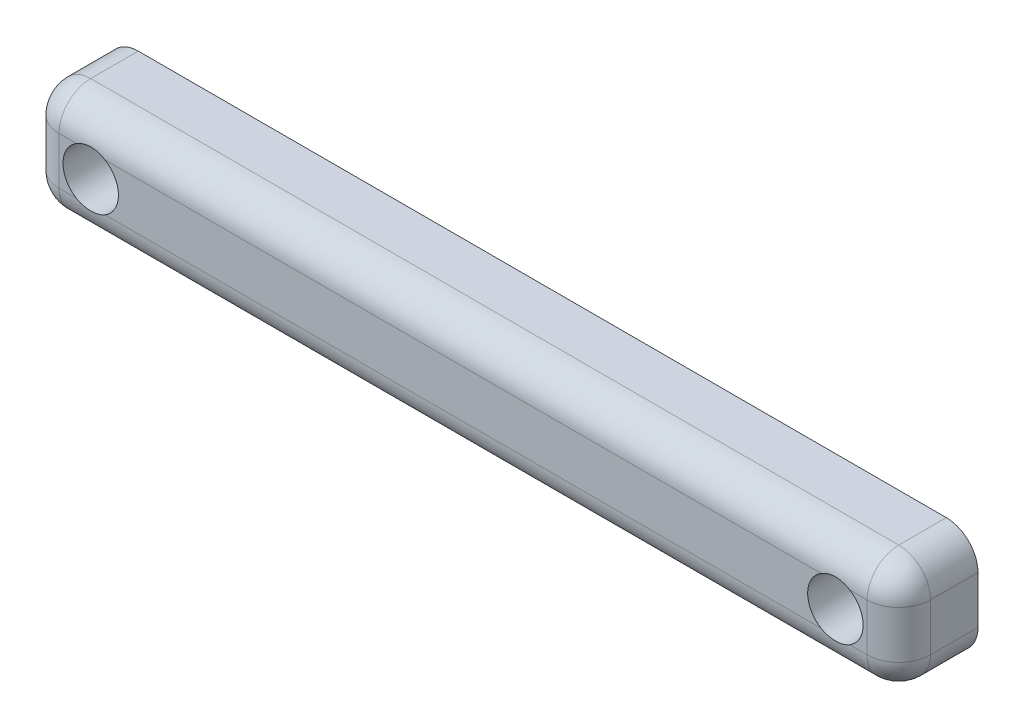
ISO-10303-21;
HEADER;
FILE_DESCRIPTION(('STEP AP214'),'2;1');
FILE_NAME('part.step','',(''),(''),'','','');
FILE_SCHEMA(('AUTOMOTIVE_DESIGN { 1 0 10303 214 1 1 1 1 }'));
ENDSEC;
DATA;
#1=APPLICATION_CONTEXT('core data for automotive mechanical design processes');
#2=APPLICATION_PROTOCOL_DEFINITION('international standard','automotive_design',2000,#1);
#3=PRODUCT_CONTEXT('',#1,'mechanical');
#4=PRODUCT('Part','Part','',(#3));
#5=PRODUCT_RELATED_PRODUCT_CATEGORY('part','',(#4));
#6=PRODUCT_DEFINITION_FORMATION('','',#4);
#7=PRODUCT_DEFINITION_CONTEXT('part definition',#1,'design');
#8=PRODUCT_DEFINITION('design','',#6,#7);
#9=PRODUCT_DEFINITION_SHAPE('','',#8);
#10=(LENGTH_UNIT() NAMED_UNIT(*) SI_UNIT(.MILLI.,.METRE.));
#11=(NAMED_UNIT(*) PLANE_ANGLE_UNIT() SI_UNIT($,.RADIAN.));
#12=(NAMED_UNIT(*) SI_UNIT($,.STERADIAN.) SOLID_ANGLE_UNIT());
#13=UNCERTAINTY_MEASURE_WITH_UNIT(LENGTH_MEASURE(1.E-05),#10,'distance_accuracy_value','');
#14=(GEOMETRIC_REPRESENTATION_CONTEXT(3) GLOBAL_UNCERTAINTY_ASSIGNED_CONTEXT((#13)) GLOBAL_UNIT_ASSIGNED_CONTEXT((#10,
#11,#12)) REPRESENTATION_CONTEXT('',''));
#15=CARTESIAN_POINT('',(0.,0.,0.));
#16=DIRECTION('',(0.,0.,1.));
#17=DIRECTION('',(1.,0.,0.));
#18=AXIS2_PLACEMENT_3D('',#15,#16,#17);
#19=CARTESIAN_POINT('',(25.5,1.5,5.));
#20=DIRECTION('',(0.,0.,-1.));
#21=DIRECTION('',(-1.,0.,0.));
#22=AXIS2_PLACEMENT_3D('',#19,#20,#21);
#23=PLANE('',#22);
#24=CARTESIAN_POINT('',(-23.5,0.,5.));
#25=DIRECTION('',(0.,0.,1.));
#26=DIRECTION('',(1.,0.,0.));
#27=AXIS2_PLACEMENT_3D('',#24,#25,#26);
#28=CIRCLE('',#27,1.75);
#29=CARTESIAN_POINT('',(-22.598612181134,-1.5,5.));
#30=VERTEX_POINT('',#29);
#31=CARTESIAN_POINT('',(-22.598612181134,1.5,5.));
#32=VERTEX_POINT('',#31);
#33=EDGE_CURVE('E168',#30,#32,#28,.T.);
#34=ORIENTED_EDGE('',*,*,#33,.F.);
#35=DIRECTION('',(1.,0.,0.));
#36=VECTOR('',#35,1.);
#37=CARTESIAN_POINT('',(25.5,-1.5,5.));
#38=LINE('',#37,#36);
#39=CARTESIAN_POINT('',(22.598612181134,-1.5,5.));
#40=VERTEX_POINT('',#39);
#41=EDGE_CURVE('E216',#30,#40,#38,.T.);
#42=ORIENTED_EDGE('',*,*,#41,.T.);
#43=CARTESIAN_POINT('',(23.5,0.,5.));
#44=DIRECTION('',(0.,0.,1.));
#45=DIRECTION('',(1.,0.,0.));
#46=AXIS2_PLACEMENT_3D('',#43,#44,#45);
#47=CIRCLE('',#46,1.75);
#48=CARTESIAN_POINT('',(22.598612181134,1.5,5.));
#49=VERTEX_POINT('',#48);
#50=EDGE_CURVE('E322',#49,#40,#47,.T.);
#51=ORIENTED_EDGE('',*,*,#50,.F.);
#52=DIRECTION('',(-1.,0.,0.));
#53=VECTOR('',#52,1.);
#54=CARTESIAN_POINT('',(25.5,1.5,5.));
#55=LINE('',#54,#53);
#56=EDGE_CURVE('E207',#49,#32,#55,.T.);
#57=ORIENTED_EDGE('',*,*,#56,.T.);
#58=EDGE_LOOP('',(#34,#42,#51,#57));
#59=FACE_BOUND('',#58,.T.);
#60=ADVANCED_FACE('F36',(#59),#23,.F.);
#61=CARTESIAN_POINT('',(24.401387818866,-1.5,5.));
#62=VERTEX_POINT('',#61);
#63=CARTESIAN_POINT('',(24.401387818866,1.5,5.));
#64=VERTEX_POINT('',#63);
#65=EDGE_CURVE('E326',#62,#64,#47,.T.);
#66=ORIENTED_EDGE('',*,*,#65,.F.);
#67=DIRECTION('',(1.,0.,0.));
#68=VECTOR('',#67,1.);
#69=CARTESIAN_POINT('',(25.5,-1.5,5.));
#70=LINE('',#69,#68);
#71=CARTESIAN_POINT('',(25.5,-1.5,5.));
#72=VERTEX_POINT('',#71);
#73=EDGE_CURVE('E214',#62,#72,#70,.T.);
#74=ORIENTED_EDGE('',*,*,#73,.T.);
#75=DIRECTION('',(0.,1.,0.));
#76=VECTOR('',#75,1.);
#77=CARTESIAN_POINT('',(25.5,1.5,5.));
#78=LINE('',#77,#76);
#79=CARTESIAN_POINT('',(25.5,1.5,5.));
#80=VERTEX_POINT('',#79);
#81=EDGE_CURVE('E211',#72,#80,#78,.T.);
#82=ORIENTED_EDGE('',*,*,#81,.T.);
#83=DIRECTION('',(-1.,0.,0.));
#84=VECTOR('',#83,1.);
#85=CARTESIAN_POINT('',(25.5,1.5,5.));
#86=LINE('',#85,#84);
#87=EDGE_CURVE('E209',#80,#64,#86,.T.);
#88=ORIENTED_EDGE('',*,*,#87,.T.);
#89=EDGE_LOOP('',(#66,#74,#82,#88));
#90=FACE_BOUND('',#89,.T.);
#91=ADVANCED_FACE('F279',(#90),#23,.F.);
#92=DIRECTION('',(0.,-1.,0.));
#93=VECTOR('',#92,1.);
#94=CARTESIAN_POINT('',(-25.5,1.5,5.));
#95=LINE('',#94,#93);
#96=CARTESIAN_POINT('',(-25.5,1.5,5.));
#97=VERTEX_POINT('',#96);
#98=CARTESIAN_POINT('',(-25.5,-1.5,5.));
#99=VERTEX_POINT('',#98);
#100=EDGE_CURVE('E203',#97,#99,#95,.T.);
#101=ORIENTED_EDGE('',*,*,#100,.T.);
#102=DIRECTION('',(1.,0.,0.));
#103=VECTOR('',#102,1.);
#104=CARTESIAN_POINT('',(25.5,-1.5,5.));
#105=LINE('',#104,#103);
#106=CARTESIAN_POINT('',(-24.401387818866,-1.5,5.));
#107=VERTEX_POINT('',#106);
#108=EDGE_CURVE('E205',#99,#107,#105,.T.);
#109=ORIENTED_EDGE('',*,*,#108,.T.);
#110=CARTESIAN_POINT('',(-24.401387818866,1.5,5.));
#111=VERTEX_POINT('',#110);
#112=EDGE_CURVE('E165',#111,#107,#28,.T.);
#113=ORIENTED_EDGE('',*,*,#112,.F.);
#114=DIRECTION('',(-1.,0.,0.));
#115=VECTOR('',#114,1.);
#116=CARTESIAN_POINT('',(25.5,1.5,5.));
#117=LINE('',#116,#115);
#118=EDGE_CURVE('E201',#111,#97,#117,.T.);
#119=ORIENTED_EDGE('',*,*,#118,.T.);
#120=EDGE_LOOP('',(#101,#109,#113,#119));
#121=FACE_BOUND('',#120,.T.);
#122=ADVANCED_FACE('F281',(#121),#23,.F.);
#123=CARTESIAN_POINT('',(25.5,1.5,0.));
#124=DIRECTION('',(0.,0.,-1.));
#125=DIRECTION('',(-1.,0.,0.));
#126=AXIS2_PLACEMENT_3D('',#123,#124,#125);
#127=PLANE('',#126);
#128=CARTESIAN_POINT('',(-23.5,0.,0.));
#129=DIRECTION('',(0.,0.,1.));
#130=DIRECTION('',(1.,0.,0.));
#131=AXIS2_PLACEMENT_3D('',#128,#129,#130);
#132=CIRCLE('',#131,1.75);
#133=CARTESIAN_POINT('',(-21.75,0.,0.));
#134=VERTEX_POINT('',#133);
#135=EDGE_CURVE('E171',#134,#134,#132,.T.);
#136=ORIENTED_EDGE('',*,*,#135,.T.);
#137=EDGE_LOOP('',(#136));
#138=FACE_BOUND('',#137,.T.);
#139=CARTESIAN_POINT('',(25.5,1.5,0.));
#140=DIRECTION('',(0.,0.,1.));
#141=DIRECTION('',(-1.,0.,0.));
#142=AXIS2_PLACEMENT_3D('',#139,#140,#141);
#143=CIRCLE('',#142,2.);
#144=CARTESIAN_POINT('',(27.5,1.5,0.));
#145=VERTEX_POINT('',#144);
#146=CARTESIAN_POINT('',(25.5,3.5,0.));
#147=VERTEX_POINT('',#146);
#148=EDGE_CURVE('E156',#145,#147,#143,.T.);
#149=ORIENTED_EDGE('',*,*,#148,.F.);
#150=DIRECTION('',(0.,1.,0.));
#151=VECTOR('',#150,1.);
#152=CARTESIAN_POINT('',(27.5,1.5,0.));
#153=LINE('',#152,#151);
#154=CARTESIAN_POINT('',(27.5,-1.5,0.));
#155=VERTEX_POINT('',#154);
#156=EDGE_CURVE('E186',#155,#145,#153,.T.);
#157=ORIENTED_EDGE('',*,*,#156,.F.);
#158=CARTESIAN_POINT('',(25.5,-1.5,0.));
#159=DIRECTION('',(0.,0.,1.));
#160=DIRECTION('',(1.,0.,0.));
#161=AXIS2_PLACEMENT_3D('',#158,#159,#160);
#162=CIRCLE('',#161,2.);
#163=CARTESIAN_POINT('',(25.5,-3.5,0.));
#164=VERTEX_POINT('',#163);
#165=EDGE_CURVE('E183',#164,#155,#162,.T.);
#166=ORIENTED_EDGE('',*,*,#165,.F.);
#167=DIRECTION('',(1.,0.,0.));
#168=VECTOR('',#167,1.);
#169=CARTESIAN_POINT('',(-25.5,-3.5,0.));
#170=LINE('',#169,#168);
#171=CARTESIAN_POINT('',(-25.5,-3.5,0.));
#172=VERTEX_POINT('',#171);
#173=EDGE_CURVE('E180',#172,#164,#170,.T.);
#174=ORIENTED_EDGE('',*,*,#173,.F.);
#175=CARTESIAN_POINT('',(-25.5,-1.5,0.));
#176=DIRECTION('',(0.,0.,1.));
#177=DIRECTION('',(1.,0.,0.));
#178=AXIS2_PLACEMENT_3D('',#175,#176,#177);
#179=CIRCLE('',#178,2.);
#180=CARTESIAN_POINT('',(-27.5,-1.5,0.));
#181=VERTEX_POINT('',#180);
#182=EDGE_CURVE('E177',#181,#172,#179,.T.);
#183=ORIENTED_EDGE('',*,*,#182,.F.);
#184=DIRECTION('',(0.,-1.,0.));
#185=VECTOR('',#184,1.);
#186=CARTESIAN_POINT('',(-27.5,1.5,0.));
#187=LINE('',#186,#185);
#188=CARTESIAN_POINT('',(-27.5,1.5,0.));
#189=VERTEX_POINT('',#188);
#190=EDGE_CURVE('E174',#189,#181,#187,.T.);
#191=ORIENTED_EDGE('',*,*,#190,.F.);
#192=CARTESIAN_POINT('',(-25.5,1.5,0.));
#193=DIRECTION('',(0.,0.,1.));
#194=DIRECTION('',(1.,0.,0.));
#195=AXIS2_PLACEMENT_3D('',#192,#193,#194);
#196=CIRCLE('',#195,2.);
#197=CARTESIAN_POINT('',(-25.5,3.5,0.));
#198=VERTEX_POINT('',#197);
#199=EDGE_CURVE('E159',#198,#189,#196,.T.);
#200=ORIENTED_EDGE('',*,*,#199,.F.);
#201=DIRECTION('',(-1.,0.,0.));
#202=VECTOR('',#201,1.);
#203=CARTESIAN_POINT('',(-25.5,3.5,0.));
#204=LINE('',#203,#202);
#205=EDGE_CURVE('E141',#147,#198,#204,.T.);
#206=ORIENTED_EDGE('',*,*,#205,.F.);
#207=EDGE_LOOP('',(#149,#157,#166,#174,#183,#191,#200,#206));
#208=FACE_BOUND('',#207,.T.);
#209=CARTESIAN_POINT('',(23.5,0.,0.));
#210=DIRECTION('',(0.,0.,1.));
#211=DIRECTION('',(1.,0.,0.));
#212=AXIS2_PLACEMENT_3D('',#209,#210,#211);
#213=CIRCLE('',#212,1.75);
#214=CARTESIAN_POINT('',(25.25,0.,0.));
#215=VERTEX_POINT('',#214);
#216=EDGE_CURVE('E312',#215,#215,#213,.T.);
#217=ORIENTED_EDGE('',*,*,#216,.T.);
#218=EDGE_LOOP('',(#217));
#219=FACE_BOUND('',#218,.T.);
#220=ADVANCED_FACE('F153',(#138,#208,#219),#127,.T.);
#221=CARTESIAN_POINT('',(25.5,1.5,5.));
#222=DIRECTION('',(0.,0.,-1.));
#223=DIRECTION('',(-1.,0.,0.));
#224=AXIS2_PLACEMENT_3D('',#221,#222,#223);
#225=CYLINDRICAL_SURFACE('',#224,2.);
#226=DIRECTION('',(0.,0.,-1.));
#227=VECTOR('',#226,1.);
#228=CARTESIAN_POINT('',(25.5,3.5,5.));
#229=LINE('',#228,#227);
#230=CARTESIAN_POINT('',(25.5,3.5,3.));
#231=VERTEX_POINT('',#230);
#232=EDGE_CURVE('E138',#231,#147,#229,.T.);
#233=ORIENTED_EDGE('',*,*,#232,.F.);
#234=CARTESIAN_POINT('',(25.5,1.5,3.));
#235=DIRECTION('',(0.,0.,-1.));
#236=DIRECTION('',(-1.,0.,0.));
#237=AXIS2_PLACEMENT_3D('',#234,#235,#236);
#238=CIRCLE('',#237,2.);
#239=CARTESIAN_POINT('',(27.5,1.5,3.));
#240=VERTEX_POINT('',#239);
#241=EDGE_CURVE('E148',#231,#240,#238,.T.);
#242=ORIENTED_EDGE('',*,*,#241,.T.);
#243=DIRECTION('',(0.,0.,-1.));
#244=VECTOR('',#243,1.);
#245=CARTESIAN_POINT('',(27.5,1.5,5.));
#246=LINE('',#245,#244);
#247=EDGE_CURVE('E163',#240,#145,#246,.T.);
#248=ORIENTED_EDGE('',*,*,#247,.T.);
#249=ORIENTED_EDGE('',*,*,#148,.T.);
#250=EDGE_LOOP('',(#233,#242,#248,#249));
#251=FACE_BOUND('',#250,.T.);
#252=ADVANCED_FACE('F161',(#251),#225,.T.);
#253=CARTESIAN_POINT('',(-25.5,3.5,5.));
#254=DIRECTION('',(0.,-1.,0.));
#255=DIRECTION('',(0.,0.,-1.));
#256=AXIS2_PLACEMENT_3D('',#253,#254,#255);
#257=PLANE('',#256);
#258=DIRECTION('',(0.,0.,-1.));
#259=VECTOR('',#258,1.);
#260=CARTESIAN_POINT('',(-25.5,3.5,5.));
#261=LINE('',#260,#259);
#262=CARTESIAN_POINT('',(-25.5,3.5,3.));
#263=VERTEX_POINT('',#262);
#264=EDGE_CURVE('E149',#263,#198,#261,.T.);
#265=ORIENTED_EDGE('',*,*,#264,.F.);
#266=DIRECTION('',(-1.,0.,0.));
#267=VECTOR('',#266,1.);
#268=CARTESIAN_POINT('',(-25.5,3.5,3.));
#269=LINE('',#268,#267);
#270=EDGE_CURVE('E11',#263,#231,#269,.F.);
#271=ORIENTED_EDGE('',*,*,#270,.T.);
#272=ORIENTED_EDGE('',*,*,#232,.T.);
#273=ORIENTED_EDGE('',*,*,#205,.T.);
#274=EDGE_LOOP('',(#265,#271,#272,#273));
#275=FACE_BOUND('',#274,.T.);
#276=ADVANCED_FACE('F140',(#275),#257,.F.);
#277=CARTESIAN_POINT('',(-25.5,1.5,5.));
#278=DIRECTION('',(0.,0.,-1.));
#279=DIRECTION('',(-1.,0.,0.));
#280=AXIS2_PLACEMENT_3D('',#277,#278,#279);
#281=CYLINDRICAL_SURFACE('',#280,2.);
#282=DIRECTION('',(0.,0.,-1.));
#283=VECTOR('',#282,1.);
#284=CARTESIAN_POINT('',(-27.5,1.5,5.));
#285=LINE('',#284,#283);
#286=CARTESIAN_POINT('',(-27.5,1.5,3.));
#287=VERTEX_POINT('',#286);
#288=EDGE_CURVE('E197',#287,#189,#285,.T.);
#289=ORIENTED_EDGE('',*,*,#288,.F.);
#290=CARTESIAN_POINT('',(-25.5,1.5,3.));
#291=DIRECTION('',(0.,0.,-1.));
#292=DIRECTION('',(-1.,0.,0.));
#293=AXIS2_PLACEMENT_3D('',#290,#291,#292);
#294=CIRCLE('',#293,2.);
#295=EDGE_CURVE('E45',#287,#263,#294,.T.);
#296=ORIENTED_EDGE('',*,*,#295,.T.);
#297=ORIENTED_EDGE('',*,*,#264,.T.);
#298=ORIENTED_EDGE('',*,*,#199,.T.);
#299=EDGE_LOOP('',(#289,#296,#297,#298));
#300=FACE_BOUND('',#299,.T.);
#301=ADVANCED_FACE('F507',(#300),#281,.T.);
#302=CARTESIAN_POINT('',(-27.5,1.5,5.));
#303=DIRECTION('',(1.,0.,0.));
#304=DIRECTION('',(0.,0.,-1.));
#305=AXIS2_PLACEMENT_3D('',#302,#303,#304);
#306=PLANE('',#305);
#307=DIRECTION('',(0.,0.,-1.));
#308=VECTOR('',#307,1.);
#309=CARTESIAN_POINT('',(-27.5,-1.5,5.));
#310=LINE('',#309,#308);
#311=CARTESIAN_POINT('',(-27.5,-1.5,3.));
#312=VERTEX_POINT('',#311);
#313=EDGE_CURVE('E195',#312,#181,#310,.T.);
#314=ORIENTED_EDGE('',*,*,#313,.F.);
#315=DIRECTION('',(0.,-1.,0.));
#316=VECTOR('',#315,1.);
#317=CARTESIAN_POINT('',(-27.5,1.5,3.));
#318=LINE('',#317,#316);
#319=EDGE_CURVE('E60',#312,#287,#318,.F.);
#320=ORIENTED_EDGE('',*,*,#319,.T.);
#321=ORIENTED_EDGE('',*,*,#288,.T.);
#322=ORIENTED_EDGE('',*,*,#190,.T.);
#323=EDGE_LOOP('',(#314,#320,#321,#322));
#324=FACE_BOUND('',#323,.T.);
#325=ADVANCED_FACE('F497',(#324),#306,.F.);
#326=CARTESIAN_POINT('',(-25.5,-1.5,5.));
#327=DIRECTION('',(0.,0.,-1.));
#328=DIRECTION('',(-1.,0.,0.));
#329=AXIS2_PLACEMENT_3D('',#326,#327,#328);
#330=CYLINDRICAL_SURFACE('',#329,2.);
#331=DIRECTION('',(0.,0.,-1.));
#332=VECTOR('',#331,1.);
#333=CARTESIAN_POINT('',(-25.5,-3.5,5.));
#334=LINE('',#333,#332);
#335=CARTESIAN_POINT('',(-25.5,-3.5,3.));
#336=VERTEX_POINT('',#335);
#337=EDGE_CURVE('E193',#336,#172,#334,.T.);
#338=ORIENTED_EDGE('',*,*,#337,.F.);
#339=CARTESIAN_POINT('',(-25.5,-1.5,3.));
#340=DIRECTION('',(0.,0.,-1.));
#341=DIRECTION('',(-1.,0.,0.));
#342=AXIS2_PLACEMENT_3D('',#339,#340,#341);
#343=CIRCLE('',#342,2.);
#344=EDGE_CURVE('E309',#336,#312,#343,.T.);
#345=ORIENTED_EDGE('',*,*,#344,.T.);
#346=ORIENTED_EDGE('',*,*,#313,.T.);
#347=ORIENTED_EDGE('',*,*,#182,.T.);
#348=EDGE_LOOP('',(#338,#345,#346,#347));
#349=FACE_BOUND('',#348,.T.);
#350=ADVANCED_FACE('F488',(#349),#330,.T.);
#351=CARTESIAN_POINT('',(-25.5,-3.5,5.));
#352=DIRECTION('',(0.,1.,0.));
#353=DIRECTION('',(0.,0.,1.));
#354=AXIS2_PLACEMENT_3D('',#351,#352,#353);
#355=PLANE('',#354);
#356=DIRECTION('',(0.,0.,-1.));
#357=VECTOR('',#356,1.);
#358=CARTESIAN_POINT('',(25.5,-3.5,5.));
#359=LINE('',#358,#357);
#360=CARTESIAN_POINT('',(25.5,-3.5,3.));
#361=VERTEX_POINT('',#360);
#362=EDGE_CURVE('E191',#361,#164,#359,.T.);
#363=ORIENTED_EDGE('',*,*,#362,.F.);
#364=DIRECTION('',(1.,0.,0.));
#365=VECTOR('',#364,1.);
#366=CARTESIAN_POINT('',(-25.5,-3.5,3.));
#367=LINE('',#366,#365);
#368=EDGE_CURVE('E332',#361,#336,#367,.F.);
#369=ORIENTED_EDGE('',*,*,#368,.T.);
#370=ORIENTED_EDGE('',*,*,#337,.T.);
#371=ORIENTED_EDGE('',*,*,#173,.T.);
#372=EDGE_LOOP('',(#363,#369,#370,#371));
#373=FACE_BOUND('',#372,.T.);
#374=ADVANCED_FACE('F478',(#373),#355,.F.);
#375=CARTESIAN_POINT('',(25.5,-1.5,5.));
#376=DIRECTION('',(0.,0.,-1.));
#377=DIRECTION('',(-1.,0.,0.));
#378=AXIS2_PLACEMENT_3D('',#375,#376,#377);
#379=CYLINDRICAL_SURFACE('',#378,2.);
#380=DIRECTION('',(0.,0.,-1.));
#381=VECTOR('',#380,1.);
#382=CARTESIAN_POINT('',(27.5,-1.5,5.));
#383=LINE('',#382,#381);
#384=CARTESIAN_POINT('',(27.5,-1.5,3.));
#385=VERTEX_POINT('',#384);
#386=EDGE_CURVE('E189',#385,#155,#383,.T.);
#387=ORIENTED_EDGE('',*,*,#386,.F.);
#388=CARTESIAN_POINT('',(25.5,-1.5,3.));
#389=DIRECTION('',(0.,0.,-1.));
#390=DIRECTION('',(-1.,0.,0.));
#391=AXIS2_PLACEMENT_3D('',#388,#389,#390);
#392=CIRCLE('',#391,2.);
#393=EDGE_CURVE('E220',#385,#361,#392,.T.);
#394=ORIENTED_EDGE('',*,*,#393,.T.);
#395=ORIENTED_EDGE('',*,*,#362,.T.);
#396=ORIENTED_EDGE('',*,*,#165,.T.);
#397=EDGE_LOOP('',(#387,#394,#395,#396));
#398=FACE_BOUND('',#397,.T.);
#399=ADVANCED_FACE('F468',(#398),#379,.T.);
#400=CARTESIAN_POINT('',(27.5,1.5,5.));
#401=DIRECTION('',(-1.,0.,0.));
#402=DIRECTION('',(0.,0.,1.));
#403=AXIS2_PLACEMENT_3D('',#400,#401,#402);
#404=PLANE('',#403);
#405=ORIENTED_EDGE('',*,*,#247,.F.);
#406=DIRECTION('',(0.,1.,0.));
#407=VECTOR('',#406,1.);
#408=CARTESIAN_POINT('',(27.5,1.5,3.));
#409=LINE('',#408,#407);
#410=EDGE_CURVE('E218',#240,#385,#409,.F.);
#411=ORIENTED_EDGE('',*,*,#410,.T.);
#412=ORIENTED_EDGE('',*,*,#386,.T.);
#413=ORIENTED_EDGE('',*,*,#156,.T.);
#414=EDGE_LOOP('',(#405,#411,#412,#413));
#415=FACE_BOUND('',#414,.T.);
#416=ADVANCED_FACE('F274',(#415),#404,.F.);
#417=CARTESIAN_POINT('',(-23.5,0.,5.));
#418=DIRECTION('',(0.,0.,-1.));
#419=DIRECTION('',(-1.,0.,0.));
#420=AXIS2_PLACEMENT_3D('',#417,#418,#419);
#421=CYLINDRICAL_SURFACE('',#420,1.75);
#422=ORIENTED_EDGE('',*,*,#112,.T.);
#423=CARTESIAN_POINT('',(-24.401387818866,-1.5,5.));
#424=CARTESIAN_POINT('',(-24.3592594217985,-1.52532137253515,4.99999253400119));
#425=CARTESIAN_POINT('',(-24.3160660722022,-1.54885605019304,4.99951886500704));
#426=CARTESIAN_POINT('',(-24.2278669590611,-1.59220599885676,4.99799304873495));
#427=CARTESIAN_POINT('',(-24.1828614135689,-1.61202171573209,4.99694097086246));
#428=CARTESIAN_POINT('',(-24.0913821722992,-1.64777939560282,4.99461303530058));
#429=CARTESIAN_POINT('',(-24.0449096941193,-1.66372448051483,4.99333735939742));
#430=CARTESIAN_POINT('',(-23.9508011787707,-1.6916532713376,4.99084469647708));
#431=CARTESIAN_POINT('',(-23.9031651388974,-1.70363696803893,4.98962770959634));
#432=CARTESIAN_POINT('',(-23.758961945761,-1.73350932253654,4.98642951811111));
#433=CARTESIAN_POINT('',(-23.6610504837817,-1.74533844269917,4.98489930805759));
#434=CARTESIAN_POINT('',(-23.4646517551786,-1.75240353616438,4.98401148980035));
#435=CARTESIAN_POINT('',(-23.3661643996284,-1.7476368754609,4.98465422647629));
#436=CARTESIAN_POINT('',(-23.1717907340789,-1.72173117319774,4.98771203069669));
#437=CARTESIAN_POINT('',(-23.0758958386564,-1.70065551428524,4.9901202350945));
#438=CARTESIAN_POINT('',(-22.8891030969923,-1.6428116811619,4.99510626760233));
#439=CARTESIAN_POINT('',(-22.7981968015215,-1.60607102687344,4.99768379156941));
#440=CARTESIAN_POINT('',(-22.6728028432007,-1.54275653616497,4.99963039026018));
#441=CARTESIAN_POINT('',(-22.6352908443688,-1.52205333954314,4.99998831752296));
#442=CARTESIAN_POINT('',(-22.598612181134,-1.5,5.));
#443=B_SPLINE_CURVE_WITH_KNOTS('',3,(#423,#424,#425,#426,#427,#428,#429,#430,#431,#432,#433,
#434,#435,#436,#437,#438,#439,#440,#441,#442),.UNSPECIFIED.,.F.,.F.,(4,2,2,2,2,2,2,2,2,4),(0.,
0.147400526038304,0.29478336879238,0.442046939744092,0.589310853051183,0.883682047103538,
1.17809996452833,1.47137937914745,1.76414567614098,1.89256483373933),.UNSPECIFIED.);
#444=EDGE_CURVE('E230',#107,#30,#443,.T.);
#445=ORIENTED_EDGE('',*,*,#444,.T.);
#446=ORIENTED_EDGE('',*,*,#33,.T.);
#447=CARTESIAN_POINT('',(-22.598612181134,1.5,5.));
#448=CARTESIAN_POINT('',(-22.6407405782015,1.52532137253515,4.99999253400119));
#449=CARTESIAN_POINT('',(-22.6839339277978,1.54885605019304,4.99951886500704));
#450=CARTESIAN_POINT('',(-22.7721330409389,1.59220599885676,4.99799304873495));
#451=CARTESIAN_POINT('',(-22.8171385864311,1.61202171573209,4.99694097086246));
#452=CARTESIAN_POINT('',(-22.9086178277008,1.64777939560282,4.99461303530058));
#453=CARTESIAN_POINT('',(-22.9550903058807,1.66372448051483,4.99333735939742));
#454=CARTESIAN_POINT('',(-23.0491988212293,1.6916532713376,4.99084469647708));
#455=CARTESIAN_POINT('',(-23.0968348611026,1.70363696803893,4.98962770959634));
#456=CARTESIAN_POINT('',(-23.241038054239,1.73350932253654,4.98642951811111));
#457=CARTESIAN_POINT('',(-23.3389495162183,1.74533844269917,4.98489930805759));
#458=CARTESIAN_POINT('',(-23.5353482448214,1.75240353616438,4.98401148980035));
#459=CARTESIAN_POINT('',(-23.6338356003716,1.7476368754609,4.98465422647629));
#460=CARTESIAN_POINT('',(-23.8282092659211,1.72173117319774,4.98771203069669));
#461=CARTESIAN_POINT('',(-23.9241041613436,1.70065551428524,4.9901202350945));
#462=CARTESIAN_POINT('',(-24.1108969030077,1.6428116811619,4.99510626760233));
#463=CARTESIAN_POINT('',(-24.2018031984785,1.60607102687344,4.99768379156941));
#464=CARTESIAN_POINT('',(-24.3271971567993,1.54275653616497,4.99963039026018));
#465=CARTESIAN_POINT('',(-24.3647091556312,1.52205333954314,4.99998831752296));
#466=CARTESIAN_POINT('',(-24.401387818866,1.5,5.));
#467=B_SPLINE_CURVE_WITH_KNOTS('',3,(#447,#448,#449,#450,#451,#452,#453,#454,#455,#456,#457,
#458,#459,#460,#461,#462,#463,#464,#465,#466),.UNSPECIFIED.,.F.,.F.,(4,2,2,2,2,2,2,2,2,4),(0.,
0.147400526038304,0.294783368792379,0.442046939744095,0.589310853051183,0.883682047103534,
1.17809996452833,1.47137937914745,1.76414567614098,1.89256483373933),.UNSPECIFIED.);
#468=EDGE_CURVE('E222',#32,#111,#467,.T.);
#469=ORIENTED_EDGE('',*,*,#468,.T.);
#470=EDGE_LOOP('',(#422,#445,#446,#469));
#471=FACE_BOUND('',#470,.T.);
#472=ORIENTED_EDGE('',*,*,#135,.F.);
#473=EDGE_LOOP('',(#472));
#474=FACE_BOUND('',#473,.T.);
#475=ADVANCED_FACE('F236',(#471,#474),#421,.F.);
#476=CARTESIAN_POINT('',(23.5,0.,5.));
#477=DIRECTION('',(0.,0.,-1.));
#478=DIRECTION('',(-1.,0.,0.));
#479=AXIS2_PLACEMENT_3D('',#476,#477,#478);
#480=CYLINDRICAL_SURFACE('',#479,1.75);
#481=ORIENTED_EDGE('',*,*,#50,.T.);
#482=CARTESIAN_POINT('',(22.598612181134,-1.5,5.));
#483=CARTESIAN_POINT('',(22.6407405782015,-1.52532137253515,4.99999253400119));
#484=CARTESIAN_POINT('',(22.6839339277978,-1.54885605019304,4.99951886500704));
#485=CARTESIAN_POINT('',(22.7721330409389,-1.59220599885676,4.99799304873495));
#486=CARTESIAN_POINT('',(22.8171385864312,-1.61202171573209,4.99694097086246));
#487=CARTESIAN_POINT('',(22.9086178277008,-1.64777939560282,4.99461303530058));
#488=CARTESIAN_POINT('',(22.9550903058807,-1.66372448051483,4.99333735939742));
#489=CARTESIAN_POINT('',(23.0491988212293,-1.69165327133759,4.99084469647708));
#490=CARTESIAN_POINT('',(23.0968348611026,-1.70363696803892,4.98962770959634));
#491=CARTESIAN_POINT('',(23.241038054239,-1.73350932253653,4.98642951811111));
#492=CARTESIAN_POINT('',(23.3389495162183,-1.74533844269916,4.98489930805759));
#493=CARTESIAN_POINT('',(23.5353482448214,-1.75240353616437,4.98401148980036));
#494=CARTESIAN_POINT('',(23.6338356003717,-1.74763687546089,4.98465422647629));
#495=CARTESIAN_POINT('',(23.8282092659211,-1.72173117319773,4.98771203069669));
#496=CARTESIAN_POINT('',(23.9241041613436,-1.70065551428522,4.9901202350945));
#497=CARTESIAN_POINT('',(24.1108969030077,-1.64281168116188,4.99510626760233));
#498=CARTESIAN_POINT('',(24.2018031984785,-1.60607102687342,4.99768379156941));
#499=CARTESIAN_POINT('',(24.3271971567993,-1.54275653616496,4.99963039026018));
#500=CARTESIAN_POINT('',(24.3647091556312,-1.52205333954313,4.99998831752296));
#501=CARTESIAN_POINT('',(24.401387818866,-1.5,5.));
#502=B_SPLINE_CURVE_WITH_KNOTS('',3,(#482,#483,#484,#485,#486,#487,#488,#489,#490,#491,#492,
#493,#494,#495,#496,#497,#498,#499,#500,#501),.UNSPECIFIED.,.F.,.F.,(4,2,2,2,2,2,2,2,2,4),(0.,
0.147400526038303,0.294783368792378,0.442046939744093,0.589310853051184,0.883682047103538,
1.17809996452833,1.47137937914745,1.76414567614098,1.8925648337393),.UNSPECIFIED.);
#503=EDGE_CURVE('E257',#40,#62,#502,.T.);
#504=ORIENTED_EDGE('',*,*,#503,.T.);
#505=ORIENTED_EDGE('',*,*,#65,.T.);
#506=CARTESIAN_POINT('',(24.401387818866,1.5,5.));
#507=CARTESIAN_POINT('',(24.3592594217986,1.52532137253515,4.99999253400119));
#508=CARTESIAN_POINT('',(24.3160660722022,1.54885605019304,4.99951886500704));
#509=CARTESIAN_POINT('',(24.2278669590611,1.59220599885677,4.99799304873495));
#510=CARTESIAN_POINT('',(24.1828614135689,1.61202171573209,4.99694097086246));
#511=CARTESIAN_POINT('',(24.0913821722992,1.64777939560283,4.99461303530058));
#512=CARTESIAN_POINT('',(24.0449096941193,1.66372448051484,4.99333735939742));
#513=CARTESIAN_POINT('',(23.9508011787708,1.6916532713376,4.99084469647708));
#514=CARTESIAN_POINT('',(23.9031651388974,1.70363696803893,4.98962770959634));
#515=CARTESIAN_POINT('',(23.758961945761,1.73350932253654,4.9864295181111));
#516=CARTESIAN_POINT('',(23.6610504837817,1.74533844269918,4.98489930805758));
#517=CARTESIAN_POINT('',(23.4646517551787,1.75240353616439,4.98401148980035));
#518=CARTESIAN_POINT('',(23.3661643996284,1.74763687546091,4.98465422647629));
#519=CARTESIAN_POINT('',(23.1717907340789,1.72173117319775,4.98771203069669));
#520=CARTESIAN_POINT('',(23.0758958386564,1.70065551428525,4.9901202350945));
#521=CARTESIAN_POINT('',(22.8891030969923,1.64281168116191,4.99510626760233));
#522=CARTESIAN_POINT('',(22.7981968015215,1.60607102687345,4.9976837915694));
#523=CARTESIAN_POINT('',(22.6728028432007,1.54275653616498,4.99963039026018));
#524=CARTESIAN_POINT('',(22.6352908443688,1.52205333954314,4.99998831752296));
#525=CARTESIAN_POINT('',(22.598612181134,1.5,5.));
#526=B_SPLINE_CURVE_WITH_KNOTS('',3,(#506,#507,#508,#509,#510,#511,#512,#513,#514,#515,#516,
#517,#518,#519,#520,#521,#522,#523,#524,#525),.UNSPECIFIED.,.F.,.F.,(4,2,2,2,2,2,2,2,2,4),(0.,
0.147400526038308,0.29478336879238,0.442046939744096,0.589310853051185,0.88368204710354,
1.17809996452833,1.47137937914745,1.76414567614098,1.89256483373936),.UNSPECIFIED.);
#527=EDGE_CURVE('E251',#64,#49,#526,.T.);
#528=ORIENTED_EDGE('',*,*,#527,.T.);
#529=EDGE_LOOP('',(#481,#504,#505,#528));
#530=FACE_BOUND('',#529,.T.);
#531=ORIENTED_EDGE('',*,*,#216,.F.);
#532=EDGE_LOOP('',(#531));
#533=FACE_BOUND('',#532,.T.);
#534=ADVANCED_FACE('F263',(#530,#533),#480,.F.);
#535=CARTESIAN_POINT('',(-25.5,-1.5,3.));
#536=DIRECTION('',(0.,0.,-1.));
#537=DIRECTION('',(-1.,0.,0.));
#538=AXIS2_PLACEMENT_3D('',#535,#536,#537);
#539=SPHERICAL_SURFACE('',#538,2.);
#540=CARTESIAN_POINT('',(-25.5,-1.5,3.));
#541=DIRECTION('',(0.,1.,0.));
#542=DIRECTION('',(-1.,0.,0.));
#543=AXIS2_PLACEMENT_3D('',#540,#541,#542);
#544=CIRCLE('',#543,2.);
#545=EDGE_CURVE('E303',#312,#99,#544,.T.);
#546=ORIENTED_EDGE('',*,*,#545,.F.);
#547=ORIENTED_EDGE('',*,*,#344,.F.);
#548=CARTESIAN_POINT('',(-25.5,-1.5,3.));
#549=DIRECTION('',(1.,0.,0.));
#550=DIRECTION('',(0.,0.,-1.));
#551=AXIS2_PLACEMENT_3D('',#548,#549,#550);
#552=CIRCLE('',#551,2.);
#553=EDGE_CURVE('E40',#99,#336,#552,.T.);
#554=ORIENTED_EDGE('',*,*,#553,.F.);
#555=EDGE_LOOP('',(#546,#547,#554));
#556=FACE_BOUND('',#555,.T.);
#557=ADVANCED_FACE('F38',(#556),#539,.T.);
#558=CARTESIAN_POINT('',(25.5,-1.5,3.));
#559=DIRECTION('',(1.,0.,0.));
#560=DIRECTION('',(0.,0.,-1.));
#561=AXIS2_PLACEMENT_3D('',#558,#559,#560);
#562=CYLINDRICAL_SURFACE('',#561,2.);
#563=ORIENTED_EDGE('',*,*,#553,.T.);
#564=ORIENTED_EDGE('',*,*,#368,.F.);
#565=CARTESIAN_POINT('',(25.5,-1.5,3.));
#566=DIRECTION('',(1.,0.,0.));
#567=DIRECTION('',(0.,0.,-1.));
#568=AXIS2_PLACEMENT_3D('',#565,#566,#567);
#569=CIRCLE('',#568,2.);
#570=EDGE_CURVE('E307',#72,#361,#569,.T.);
#571=ORIENTED_EDGE('',*,*,#570,.F.);
#572=ORIENTED_EDGE('',*,*,#73,.F.);
#573=ORIENTED_EDGE('',*,*,#503,.F.);
#574=ORIENTED_EDGE('',*,*,#41,.F.);
#575=ORIENTED_EDGE('',*,*,#444,.F.);
#576=ORIENTED_EDGE('',*,*,#108,.F.);
#577=EDGE_LOOP('',(#563,#564,#571,#572,#573,#574,#575,#576));
#578=FACE_BOUND('',#577,.T.);
#579=ADVANCED_FACE('F272',(#578),#562,.T.);
#580=CARTESIAN_POINT('',(-25.5,1.5,3.));
#581=DIRECTION('',(0.,-1.,0.));
#582=DIRECTION('',(0.,0.,-1.));
#583=AXIS2_PLACEMENT_3D('',#580,#581,#582);
#584=CYLINDRICAL_SURFACE('',#583,2.);
#585=ORIENTED_EDGE('',*,*,#545,.T.);
#586=ORIENTED_EDGE('',*,*,#100,.F.);
#587=CARTESIAN_POINT('',(-25.5,1.5,3.));
#588=DIRECTION('',(0.,1.,0.));
#589=DIRECTION('',(0.,0.,1.));
#590=AXIS2_PLACEMENT_3D('',#587,#588,#589);
#591=CIRCLE('',#590,2.);
#592=EDGE_CURVE('E350',#287,#97,#591,.T.);
#593=ORIENTED_EDGE('',*,*,#592,.F.);
#594=ORIENTED_EDGE('',*,*,#319,.F.);
#595=EDGE_LOOP('',(#585,#586,#593,#594));
#596=FACE_BOUND('',#595,.T.);
#597=ADVANCED_FACE('F305',(#596),#584,.T.);
#598=CARTESIAN_POINT('',(25.5,-1.5,3.));
#599=DIRECTION('',(0.,0.,-1.));
#600=DIRECTION('',(-1.,0.,0.));
#601=AXIS2_PLACEMENT_3D('',#598,#599,#600);
#602=SPHERICAL_SURFACE('',#601,2.);
#603=ORIENTED_EDGE('',*,*,#570,.T.);
#604=ORIENTED_EDGE('',*,*,#393,.F.);
#605=CARTESIAN_POINT('',(25.5,-1.5,3.));
#606=DIRECTION('',(0.,1.,0.));
#607=DIRECTION('',(0.,0.,1.));
#608=AXIS2_PLACEMENT_3D('',#605,#606,#607);
#609=CIRCLE('',#608,2.);
#610=EDGE_CURVE('E347',#72,#385,#609,.T.);
#611=ORIENTED_EDGE('',*,*,#610,.F.);
#612=EDGE_LOOP('',(#603,#604,#611));
#613=FACE_BOUND('',#612,.T.);
#614=ADVANCED_FACE('F356',(#613),#602,.T.);
#615=CARTESIAN_POINT('',(-25.5,1.5,3.));
#616=DIRECTION('',(0.,0.,-1.));
#617=DIRECTION('',(-1.,0.,0.));
#618=AXIS2_PLACEMENT_3D('',#615,#616,#617);
#619=SPHERICAL_SURFACE('',#618,2.);
#620=ORIENTED_EDGE('',*,*,#295,.F.);
#621=ORIENTED_EDGE('',*,*,#592,.T.);
#622=CARTESIAN_POINT('',(-25.5,1.5,3.));
#623=DIRECTION('',(1.,0.,0.));
#624=DIRECTION('',(0.,0.,-1.));
#625=AXIS2_PLACEMENT_3D('',#622,#623,#624);
#626=CIRCLE('',#625,2.);
#627=EDGE_CURVE('E344',#263,#97,#626,.T.);
#628=ORIENTED_EDGE('',*,*,#627,.F.);
#629=EDGE_LOOP('',(#620,#621,#628));
#630=FACE_BOUND('',#629,.T.);
#631=ADVANCED_FACE('F365',(#630),#619,.T.);
#632=CARTESIAN_POINT('',(25.5,1.5,3.));
#633=DIRECTION('',(0.,1.,0.));
#634=DIRECTION('',(0.,0.,1.));
#635=AXIS2_PLACEMENT_3D('',#632,#633,#634);
#636=CYLINDRICAL_SURFACE('',#635,2.);
#637=ORIENTED_EDGE('',*,*,#610,.T.);
#638=ORIENTED_EDGE('',*,*,#410,.F.);
#639=CARTESIAN_POINT('',(25.5,1.5,3.));
#640=DIRECTION('',(0.,1.,0.));
#641=DIRECTION('',(-1.,0.,0.));
#642=AXIS2_PLACEMENT_3D('',#639,#640,#641);
#643=CIRCLE('',#642,2.);
#644=EDGE_CURVE('E342',#80,#240,#643,.T.);
#645=ORIENTED_EDGE('',*,*,#644,.F.);
#646=ORIENTED_EDGE('',*,*,#81,.F.);
#647=EDGE_LOOP('',(#637,#638,#645,#646));
#648=FACE_BOUND('',#647,.T.);
#649=ADVANCED_FACE('F246',(#648),#636,.T.);
#650=CARTESIAN_POINT('',(25.5,1.5,3.));
#651=DIRECTION('',(-1.,0.,0.));
#652=DIRECTION('',(0.,0.,1.));
#653=AXIS2_PLACEMENT_3D('',#650,#651,#652);
#654=CYLINDRICAL_SURFACE('',#653,2.);
#655=ORIENTED_EDGE('',*,*,#527,.F.);
#656=ORIENTED_EDGE('',*,*,#87,.F.);
#657=CARTESIAN_POINT('',(25.5,1.5,3.));
#658=DIRECTION('',(1.,0.,0.));
#659=DIRECTION('',(0.,0.,-1.));
#660=AXIS2_PLACEMENT_3D('',#657,#658,#659);
#661=CIRCLE('',#660,2.);
#662=EDGE_CURVE('E340',#231,#80,#661,.T.);
#663=ORIENTED_EDGE('',*,*,#662,.F.);
#664=ORIENTED_EDGE('',*,*,#270,.F.);
#665=ORIENTED_EDGE('',*,*,#627,.T.);
#666=ORIENTED_EDGE('',*,*,#118,.F.);
#667=ORIENTED_EDGE('',*,*,#468,.F.);
#668=ORIENTED_EDGE('',*,*,#56,.F.);
#669=EDGE_LOOP('',(#655,#656,#663,#664,#665,#666,#667,#668));
#670=FACE_BOUND('',#669,.T.);
#671=ADVANCED_FACE('F240',(#670),#654,.T.);
#672=CARTESIAN_POINT('',(25.5,1.5,3.));
#673=DIRECTION('',(0.,0.,-1.));
#674=DIRECTION('',(-1.,0.,0.));
#675=AXIS2_PLACEMENT_3D('',#672,#673,#674);
#676=SPHERICAL_SURFACE('',#675,2.);
#677=ORIENTED_EDGE('',*,*,#644,.T.);
#678=ORIENTED_EDGE('',*,*,#241,.F.);
#679=ORIENTED_EDGE('',*,*,#662,.T.);
#680=EDGE_LOOP('',(#677,#678,#679));
#681=FACE_BOUND('',#680,.T.);
#682=ADVANCED_FACE('F245',(#681),#676,.T.);
#683=CLOSED_SHELL('',(#60,#91,#122,#220,#252,#276,#301,#325,#350,#374,#399,#416,#475,#534,#557,
#579,#597,#614,#631,#649,#671,#682));
#684=MANIFOLD_SOLID_BREP('B2',#683);
#685=ADVANCED_BREP_SHAPE_REPRESENTATION('',(#18,#684),#14);
#686=SHAPE_DEFINITION_REPRESENTATION(#9,#685);
ENDSEC;
END-ISO-10303-21;
